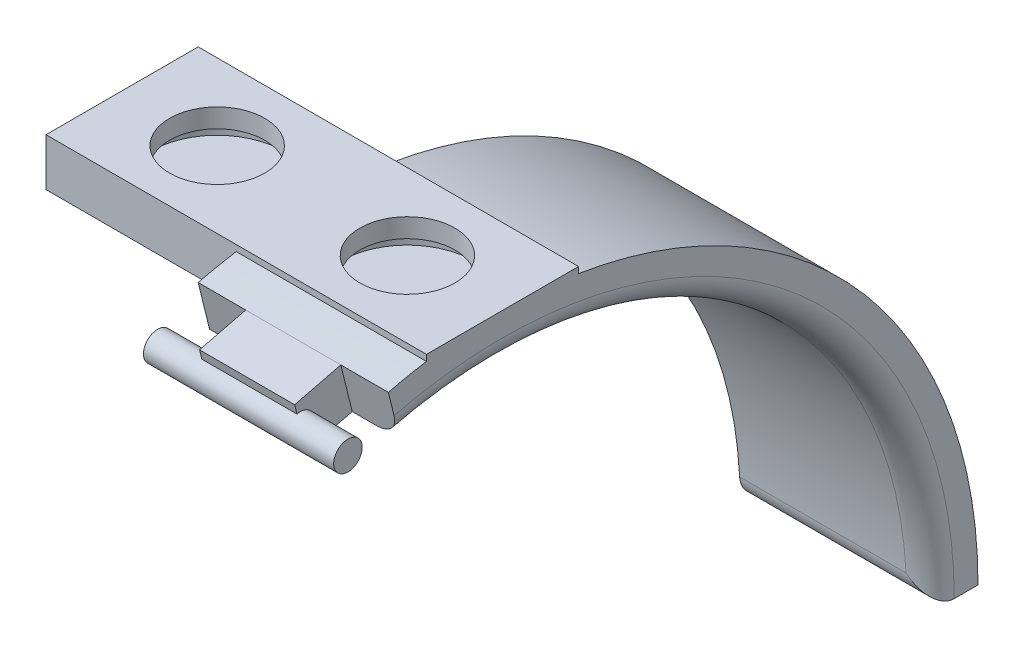
ISO-10303-21;
HEADER;
FILE_DESCRIPTION(('STEP AP214'),'2;1');
FILE_NAME('part.step','',(''),(''),'','','');
FILE_SCHEMA(('AUTOMOTIVE_DESIGN { 1 0 10303 214 1 1 1 1 }'));
ENDSEC;
DATA;
#1=APPLICATION_CONTEXT('core data for automotive mechanical design processes');
#2=APPLICATION_PROTOCOL_DEFINITION('international standard','automotive_design',2000,#1);
#3=PRODUCT_CONTEXT('',#1,'mechanical');
#4=PRODUCT('Part','Part','',(#3));
#5=PRODUCT_RELATED_PRODUCT_CATEGORY('part','',(#4));
#6=PRODUCT_DEFINITION_FORMATION('','',#4);
#7=PRODUCT_DEFINITION_CONTEXT('part definition',#1,'design');
#8=PRODUCT_DEFINITION('design','',#6,#7);
#9=PRODUCT_DEFINITION_SHAPE('','',#8);
#10=(LENGTH_UNIT() NAMED_UNIT(*) SI_UNIT(.MILLI.,.METRE.));
#11=(NAMED_UNIT(*) PLANE_ANGLE_UNIT() SI_UNIT($,.RADIAN.));
#12=(NAMED_UNIT(*) SI_UNIT($,.STERADIAN.) SOLID_ANGLE_UNIT());
#13=UNCERTAINTY_MEASURE_WITH_UNIT(LENGTH_MEASURE(1.E-05),#10,'distance_accuracy_value','');
#14=(GEOMETRIC_REPRESENTATION_CONTEXT(3) GLOBAL_UNCERTAINTY_ASSIGNED_CONTEXT((#13)) GLOBAL_UNIT_ASSIGNED_CONTEXT((#10,
#11,#12)) REPRESENTATION_CONTEXT('',''));
#15=CARTESIAN_POINT('',(0.,0.,0.));
#16=DIRECTION('',(0.,0.,1.));
#17=DIRECTION('',(1.,0.,0.));
#18=AXIS2_PLACEMENT_3D('',#15,#16,#17);
#19=CARTESIAN_POINT('',(0.,-1.2,4.85386443980464));
#20=DIRECTION('',(0.,-0.24,0.970772887960928));
#21=DIRECTION('',(0.,-0.970772887960928,-0.24));
#22=AXIS2_PLACEMENT_3D('',#19,#20,#21);
#23=PLANE('',#22);
#24=DIRECTION('',(1.,0.,0.));
#25=VECTOR('',#24,1.);
#26=CARTESIAN_POINT('',(0.,46.3678715100855,16.6138644398046));
#27=LINE('',#26,#25);
#28=CARTESIAN_POINT('',(15.,46.3678715100855,16.6138644398046));
#29=VERTEX_POINT('',#28);
#30=CARTESIAN_POINT('',(5.,46.3678715100855,16.6138644398046));
#31=VERTEX_POINT('',#30);
#32=EDGE_CURVE('E168',#29,#31,#27,.F.);
#33=ORIENTED_EDGE('',*,*,#32,.F.);
#34=DIRECTION('',(0.,-0.970772887960928,-0.24));
#35=VECTOR('',#34,1.);
#36=CARTESIAN_POINT('',(15.,42.4847799582418,15.6538644398046));
#37=LINE('',#36,#35);
#38=CARTESIAN_POINT('',(15.,47.3386443980464,16.8538644398046));
#39=VERTEX_POINT('',#38);
#40=EDGE_CURVE('E171',#39,#29,#37,.T.);
#41=ORIENTED_EDGE('',*,*,#40,.F.);
#42=DIRECTION('',(-1.,0.,0.));
#43=VECTOR('',#42,1.);
#44=CARTESIAN_POINT('',(10.,47.3386443980464,16.8538644398046));
#45=LINE('',#44,#43);
#46=CARTESIAN_POINT('',(5.,47.3386443980464,16.8538644398046));
#47=VERTEX_POINT('',#46);
#48=EDGE_CURVE('E210',#39,#47,#45,.T.);
#49=ORIENTED_EDGE('',*,*,#48,.T.);
#50=DIRECTION('',(0.,-0.970772887960928,-0.24));
#51=VECTOR('',#50,1.);
#52=CARTESIAN_POINT('',(5.,42.4847799582418,15.6538644398046));
#53=LINE('',#52,#51);
#54=EDGE_CURVE('E173',#47,#31,#53,.T.);
#55=ORIENTED_EDGE('',*,*,#54,.T.);
#56=EDGE_LOOP('',(#33,#41,#49,#55));
#57=FACE_BOUND('',#56,.T.);
#58=ADVANCED_FACE('F35',(#57),#23,.T.);
#59=CARTESIAN_POINT('',(15.,43.4555528462027,15.8938644398046));
#60=VERTEX_POINT('',#59);
#61=CARTESIAN_POINT('',(15.,42.4847799582418,15.6538644398046));
#62=VERTEX_POINT('',#61);
#63=EDGE_CURVE('E192',#60,#62,#37,.T.);
#64=ORIENTED_EDGE('',*,*,#63,.F.);
#65=DIRECTION('',(1.,0.,0.));
#66=VECTOR('',#65,1.);
#67=CARTESIAN_POINT('',(0.,43.4555528462027,15.8938644398046));
#68=LINE('',#67,#66);
#69=CARTESIAN_POINT('',(5.,43.4555528462027,15.8938644398046));
#70=VERTEX_POINT('',#69);
#71=EDGE_CURVE('E176',#70,#60,#68,.T.);
#72=ORIENTED_EDGE('',*,*,#71,.F.);
#73=CARTESIAN_POINT('',(5.,42.4847799582418,15.6538644398046));
#74=VERTEX_POINT('',#73);
#75=EDGE_CURVE('E212',#70,#74,#53,.T.);
#76=ORIENTED_EDGE('',*,*,#75,.T.);
#77=DIRECTION('',(1.,0.,0.));
#78=VECTOR('',#77,1.);
#79=CARTESIAN_POINT('',(10.,42.4847799582418,15.6538644398046));
#80=LINE('',#79,#78);
#81=EDGE_CURVE('E215',#74,#62,#80,.T.);
#82=ORIENTED_EDGE('',*,*,#81,.T.);
#83=EDGE_LOOP('',(#64,#72,#76,#82));
#84=FACE_BOUND('',#83,.T.);
#85=ADVANCED_FACE('F397',(#84),#23,.T.);
#86=CARTESIAN_POINT('',(15.,42.4847799582418,15.6538644398046));
#87=DIRECTION('',(1.,0.,0.));
#88=DIRECTION('',(0.,0.,-1.));
#89=AXIS2_PLACEMENT_3D('',#86,#87,#88);
#90=PLANE('',#89);
#91=ORIENTED_EDGE('',*,*,#40,.T.);
#92=CARTESIAN_POINT('',(15.,44.9117121781441,16.2538644398046));
#93=DIRECTION('',(1.,0.,0.));
#94=DIRECTION('',(0.,0.,-1.));
#95=AXIS2_PLACEMENT_3D('',#92,#93,#94);
#96=CIRCLE('',#95,1.5);
#97=EDGE_CURVE('E180',#29,#60,#96,.F.);
#98=ORIENTED_EDGE('',*,*,#97,.T.);
#99=ORIENTED_EDGE('',*,*,#63,.T.);
#100=DIRECTION('',(0.,0.24,-0.970772887960928));
#101=VECTOR('',#100,1.);
#102=CARTESIAN_POINT('',(15.,42.4847799582418,15.6538644398046));
#103=LINE('',#102,#101);
#104=CARTESIAN_POINT('',(15.,43.6847799582418,10.8));
#105=VERTEX_POINT('',#104);
#106=EDGE_CURVE('E194',#62,#105,#103,.T.);
#107=ORIENTED_EDGE('',*,*,#106,.T.);
#108=DIRECTION('',(0.,-0.970772887960928,-0.24));
#109=VECTOR('',#108,1.);
#110=CARTESIAN_POINT('',(15.,43.6847799582418,10.8));
#111=LINE('',#110,#109);
#112=CARTESIAN_POINT('',(15.,48.5386443980464,12.));
#113=VERTEX_POINT('',#112);
#114=EDGE_CURVE('E196',#113,#105,#111,.T.);
#115=ORIENTED_EDGE('',*,*,#114,.F.);
#116=DIRECTION('',(0.,0.24,-0.970772887960928));
#117=VECTOR('',#116,1.);
#118=CARTESIAN_POINT('',(15.,47.3386443980464,16.8538644398046));
#119=LINE('',#118,#117);
#120=EDGE_CURVE('E191',#39,#113,#119,.T.);
#121=ORIENTED_EDGE('',*,*,#120,.F.);
#122=EDGE_LOOP('',(#91,#98,#99,#107,#115,#121));
#123=FACE_BOUND('',#122,.T.);
#124=ADVANCED_FACE('F188',(#123),#90,.T.);
#125=CARTESIAN_POINT('',(0.,0.,0.));
#126=DIRECTION('',(0.,-0.24,0.970772887960928));
#127=DIRECTION('',(0.,-0.970772887960928,-0.24));
#128=AXIS2_PLACEMENT_3D('',#125,#126,#127);
#129=PLANE('',#128);
#130=DIRECTION('',(1.,0.,0.));
#131=VECTOR('',#130,1.);
#132=CARTESIAN_POINT('',(0.,43.6847799582418,10.8));
#133=LINE('',#132,#131);
#134=CARTESIAN_POINT('',(17.5,43.6847799582418,10.8));
#135=VERTEX_POINT('',#134);
#136=EDGE_CURVE('E230',#105,#135,#133,.T.);
#137=ORIENTED_EDGE('',*,*,#136,.T.);
#138=CARTESIAN_POINT('',(17.5,46.1117121781441,11.4));
#139=DIRECTION('',(0.,-0.24,0.970772887960928));
#140=DIRECTION('',(0.,-0.970772887960928,-0.24));
#141=AXIS2_PLACEMENT_3D('',#138,#139,#140);
#142=CIRCLE('',#141,2.5);
#143=CARTESIAN_POINT('',(20.,46.1117121781441,11.4));
#144=VERTEX_POINT('',#143);
#145=EDGE_CURVE('E48',#135,#144,#142,.T.);
#146=ORIENTED_EDGE('',*,*,#145,.T.);
#147=DIRECTION('',(0.,0.970772887960928,0.24));
#148=VECTOR('',#147,1.);
#149=CARTESIAN_POINT('',(20.,48.5386443980464,12.));
#150=LINE('',#149,#148);
#151=CARTESIAN_POINT('',(20.,48.5386443980464,12.));
#152=VERTEX_POINT('',#151);
#153=EDGE_CURVE('E234',#144,#152,#150,.T.);
#154=ORIENTED_EDGE('',*,*,#153,.T.);
#155=DIRECTION('',(-1.,0.,0.));
#156=VECTOR('',#155,1.);
#157=CARTESIAN_POINT('',(0.,48.5386443980464,12.));
#158=LINE('',#157,#156);
#159=EDGE_CURVE('E238',#152,#113,#158,.T.);
#160=ORIENTED_EDGE('',*,*,#159,.T.);
#161=ORIENTED_EDGE('',*,*,#114,.T.);
#162=EDGE_LOOP('',(#137,#146,#154,#160,#161));
#163=FACE_BOUND('',#162,.T.);
#164=ADVANCED_FACE('F327',(#163),#129,.T.);
#165=CARTESIAN_POINT('',(0.,43.6847799582418,10.8));
#166=VERTEX_POINT('',#165);
#167=CARTESIAN_POINT('',(5.,43.6847799582418,10.8));
#168=VERTEX_POINT('',#167);
#169=EDGE_CURVE('E231',#166,#168,#133,.T.);
#170=ORIENTED_EDGE('',*,*,#169,.T.);
#171=DIRECTION('',(0.,-0.970772887960928,-0.24));
#172=VECTOR('',#171,1.);
#173=CARTESIAN_POINT('',(5.,43.6847799582418,10.8));
#174=LINE('',#173,#172);
#175=CARTESIAN_POINT('',(5.,48.5386443980464,12.));
#176=VERTEX_POINT('',#175);
#177=EDGE_CURVE('E213',#176,#168,#174,.T.);
#178=ORIENTED_EDGE('',*,*,#177,.F.);
#179=CARTESIAN_POINT('',(0.,48.5386443980464,12.));
#180=VERTEX_POINT('',#179);
#181=EDGE_CURVE('E237',#176,#180,#158,.T.);
#182=ORIENTED_EDGE('',*,*,#181,.T.);
#183=DIRECTION('',(0.,-0.970772887960928,-0.24));
#184=VECTOR('',#183,1.);
#185=CARTESIAN_POINT('',(0.,48.5386443980464,12.));
#186=LINE('',#185,#184);
#187=EDGE_CURVE('E228',#180,#166,#186,.T.);
#188=ORIENTED_EDGE('',*,*,#187,.T.);
#189=EDGE_LOOP('',(#170,#178,#182,#188));
#190=FACE_BOUND('',#189,.T.);
#191=ADVANCED_FACE('F381',(#190),#129,.T.);
#192=CARTESIAN_POINT('',(20.,0.,0.));
#193=DIRECTION('',(-1.,0.,0.));
#194=DIRECTION('',(0.,0.,1.));
#195=AXIS2_PLACEMENT_3D('',#192,#193,#194);
#196=CYLINDRICAL_SURFACE('',#195,50.);
#197=ORIENTED_EDGE('',*,*,#159,.F.);
#198=CARTESIAN_POINT('',(20.,0.,0.));
#199=DIRECTION('',(1.,0.,0.));
#200=DIRECTION('',(0.,0.,-1.));
#201=AXIS2_PLACEMENT_3D('',#198,#199,#200);
#202=CIRCLE('',#201,50.);
#203=CARTESIAN_POINT('',(20.,49.3558507170123,8.));
#204=VERTEX_POINT('',#203);
#205=EDGE_CURVE('E291',#204,#152,#202,.T.);
#206=ORIENTED_EDGE('',*,*,#205,.F.);
#207=DIRECTION('',(-1.,0.,0.));
#208=VECTOR('',#207,1.);
#209=CARTESIAN_POINT('',(20.,49.3558507170123,8.));
#210=LINE('',#209,#208);
#211=CARTESIAN_POINT('',(0.,49.3558507170123,8.));
#212=VERTEX_POINT('',#211);
#213=EDGE_CURVE('E285',#204,#212,#210,.T.);
#214=ORIENTED_EDGE('',*,*,#213,.T.);
#215=CARTESIAN_POINT('',(0.,0.,0.));
#216=DIRECTION('',(1.,0.,0.));
#217=DIRECTION('',(0.,0.,-1.));
#218=AXIS2_PLACEMENT_3D('',#215,#216,#217);
#219=CIRCLE('',#218,50.);
#220=EDGE_CURVE('E301',#212,#180,#219,.T.);
#221=ORIENTED_EDGE('',*,*,#220,.T.);
#222=ORIENTED_EDGE('',*,*,#181,.F.);
#223=DIRECTION('',(-1.,0.,0.));
#224=VECTOR('',#223,1.);
#225=CARTESIAN_POINT('',(10.,48.5386443980464,12.));
#226=LINE('',#225,#224);
#227=EDGE_CURVE('E209',#113,#176,#226,.T.);
#228=ORIENTED_EDGE('',*,*,#227,.F.);
#229=EDGE_LOOP('',(#197,#206,#214,#221,#222,#228));
#230=FACE_BOUND('',#229,.T.);
#231=ADVANCED_FACE('F368',(#230),#196,.T.);
#232=CARTESIAN_POINT('',(0.,0.,0.));
#233=DIRECTION('',(1.,0.,0.));
#234=DIRECTION('',(0.,0.,-1.));
#235=AXIS2_PLACEMENT_3D('',#232,#233,#234);
#236=PLANE('',#235);
#237=ORIENTED_EDGE('',*,*,#187,.F.);
#238=ORIENTED_EDGE('',*,*,#220,.F.);
#239=DIRECTION('',(0.,-1.,0.));
#240=VECTOR('',#239,1.);
#241=CARTESIAN_POINT('',(0.,0.,8.));
#242=LINE('',#241,#240);
#243=CARTESIAN_POINT('',(0.,45.,8.));
#244=VERTEX_POINT('',#243);
#245=EDGE_CURVE('E177',#212,#244,#242,.T.);
#246=ORIENTED_EDGE('',*,*,#245,.T.);
#247=DIRECTION('',(0.,0.,-1.));
#248=VECTOR('',#247,1.);
#249=CARTESIAN_POINT('',(0.,45.,0.));
#250=LINE('',#249,#248);
#251=CARTESIAN_POINT('',(0.,45.,0.));
#252=VERTEX_POINT('',#251);
#253=EDGE_CURVE('E309',#244,#252,#250,.T.);
#254=ORIENTED_EDGE('',*,*,#253,.T.);
#255=CARTESIAN_POINT('',(0.,0.,0.));
#256=DIRECTION('',(-1.,0.,0.));
#257=DIRECTION('',(0.,0.,-1.));
#258=AXIS2_PLACEMENT_3D('',#255,#256,#257);
#259=CIRCLE('',#258,45.);
#260=EDGE_CURVE('E297',#166,#252,#259,.T.);
#261=ORIENTED_EDGE('',*,*,#260,.F.);
#262=EDGE_LOOP('',(#237,#238,#246,#254,#261));
#263=FACE_BOUND('',#262,.T.);
#264=ADVANCED_FACE('F361',(#263),#236,.F.);
#265=CARTESIAN_POINT('',(20.,0.,0.));
#266=DIRECTION('',(-1.,0.,0.));
#267=DIRECTION('',(0.,0.,1.));
#268=AXIS2_PLACEMENT_3D('',#265,#266,#267);
#269=CYLINDRICAL_SURFACE('',#268,45.);
#270=DIRECTION('',(-1.,0.,0.));
#271=VECTOR('',#270,1.);
#272=CARTESIAN_POINT('',(20.,2.36842105263158,-44.9376299076559));
#273=LINE('',#272,#271);
#274=CARTESIAN_POINT('',(0.,2.36842105263158,-44.9376299076559));
#275=VERTEX_POINT('',#274);
#276=CARTESIAN_POINT('',(17.5,2.36842105263158,-44.9376299076559));
#277=VERTEX_POINT('',#276);
#278=EDGE_CURVE('E55',#275,#277,#273,.F.);
#279=ORIENTED_EDGE('',*,*,#278,.T.);
#280=CARTESIAN_POINT('',(17.5,0.,0.));
#281=DIRECTION('',(1.,0.,0.));
#282=DIRECTION('',(0.,0.,-1.));
#283=AXIS2_PLACEMENT_3D('',#280,#281,#282);
#284=CIRCLE('',#283,45.);
#285=EDGE_CURVE('E59',#277,#135,#284,.T.);
#286=ORIENTED_EDGE('',*,*,#285,.T.);
#287=ORIENTED_EDGE('',*,*,#136,.F.);
#288=EDGE_CURVE('E235',#168,#105,#133,.T.);
#289=ORIENTED_EDGE('',*,*,#288,.F.);
#290=ORIENTED_EDGE('',*,*,#169,.F.);
#291=ORIENTED_EDGE('',*,*,#260,.T.);
#292=EDGE_CURVE('E288',#252,#275,#259,.T.);
#293=ORIENTED_EDGE('',*,*,#292,.T.);
#294=EDGE_LOOP('',(#279,#286,#287,#289,#290,#291,#293));
#295=FACE_BOUND('',#294,.T.);
#296=ADVANCED_FACE('F350',(#295),#269,.F.);
#297=CARTESIAN_POINT('',(20.,0.,0.));
#298=DIRECTION('',(1.,0.,0.));
#299=DIRECTION('',(0.,0.,-1.));
#300=AXIS2_PLACEMENT_3D('',#297,#298,#299);
#301=PLANE('',#300);
#302=ORIENTED_EDGE('',*,*,#153,.F.);
#303=CARTESIAN_POINT('',(20.,0.,0.));
#304=DIRECTION('',(1.,0.,0.));
#305=DIRECTION('',(0.,0.,-1.));
#306=AXIS2_PLACEMENT_3D('',#303,#304,#305);
#307=CIRCLE('',#306,47.5);
#308=CARTESIAN_POINT('',(20.,0.,-47.5));
#309=VERTEX_POINT('',#308);
#310=EDGE_CURVE('E185',#144,#309,#307,.F.);
#311=ORIENTED_EDGE('',*,*,#310,.T.);
#312=DIRECTION('',(0.,0.,-1.));
#313=VECTOR('',#312,1.);
#314=CARTESIAN_POINT('',(20.,0.,-45.));
#315=LINE('',#314,#313);
#316=CARTESIAN_POINT('',(20.,0.,-50.));
#317=VERTEX_POINT('',#316);
#318=EDGE_CURVE('E289',#309,#317,#315,.T.);
#319=ORIENTED_EDGE('',*,*,#318,.T.);
#320=CARTESIAN_POINT('',(20.,49.3558507170123,-8.));
#321=VERTEX_POINT('',#320);
#322=EDGE_CURVE('E293',#317,#321,#202,.T.);
#323=ORIENTED_EDGE('',*,*,#322,.T.);
#324=DIRECTION('',(0.,1.,0.));
#325=VECTOR('',#324,1.);
#326=CARTESIAN_POINT('',(20.,45.,-8.));
#327=LINE('',#326,#325);
#328=CARTESIAN_POINT('',(20.,50.,-8.));
#329=VERTEX_POINT('',#328);
#330=EDGE_CURVE('E253',#321,#329,#327,.T.);
#331=ORIENTED_EDGE('',*,*,#330,.T.);
#332=DIRECTION('',(0.,0.,1.));
#333=VECTOR('',#332,1.);
#334=CARTESIAN_POINT('',(20.,50.,-8.));
#335=LINE('',#334,#333);
#336=CARTESIAN_POINT('',(20.,50.,8.));
#337=VERTEX_POINT('',#336);
#338=EDGE_CURVE('E255',#329,#337,#335,.T.);
#339=ORIENTED_EDGE('',*,*,#338,.T.);
#340=DIRECTION('',(0.,-1.,0.));
#341=VECTOR('',#340,1.);
#342=CARTESIAN_POINT('',(20.,50.,8.));
#343=LINE('',#342,#341);
#344=EDGE_CURVE('E257',#337,#204,#343,.T.);
#345=ORIENTED_EDGE('',*,*,#344,.T.);
#346=ORIENTED_EDGE('',*,*,#205,.T.);
#347=EDGE_LOOP('',(#302,#311,#319,#323,#331,#339,#345,#346));
#348=FACE_BOUND('',#347,.T.);
#349=ADVANCED_FACE('F333',(#348),#301,.T.);
#350=CARTESIAN_POINT('',(20.,0.,-45.));
#351=DIRECTION('',(0.,1.,0.));
#352=DIRECTION('',(0.,0.,1.));
#353=AXIS2_PLACEMENT_3D('',#350,#351,#352);
#354=PLANE('',#353);
#355=ORIENTED_EDGE('',*,*,#318,.F.);
#356=CARTESIAN_POINT('',(17.5,0.,-47.5));
#357=DIRECTION('',(0.,1.,0.));
#358=DIRECTION('',(0.,0.,1.));
#359=AXIS2_PLACEMENT_3D('',#356,#357,#358);
#360=CIRCLE('',#359,2.5);
#361=CARTESIAN_POINT('',(19.9991329976495,0.,-47.4341649025257));
#362=VERTEX_POINT('',#361);
#363=EDGE_CURVE('E320',#309,#362,#360,.F.);
#364=ORIENTED_EDGE('',*,*,#363,.T.);
#365=DIRECTION('',(-1.,0.,0.));
#366=VECTOR('',#365,1.);
#367=CARTESIAN_POINT('',(20.,0.,-47.4341649025257));
#368=LINE('',#367,#366);
#369=CARTESIAN_POINT('',(0.,0.,-47.4341649025257));
#370=VERTEX_POINT('',#369);
#371=EDGE_CURVE('E318',#362,#370,#368,.T.);
#372=ORIENTED_EDGE('',*,*,#371,.T.);
#373=DIRECTION('',(0.,0.,-1.));
#374=VECTOR('',#373,1.);
#375=CARTESIAN_POINT('',(0.,0.,-45.));
#376=LINE('',#375,#374);
#377=CARTESIAN_POINT('',(0.,0.,-50.));
#378=VERTEX_POINT('',#377);
#379=EDGE_CURVE('E299',#370,#378,#376,.T.);
#380=ORIENTED_EDGE('',*,*,#379,.T.);
#381=DIRECTION('',(-1.,0.,0.));
#382=VECTOR('',#381,1.);
#383=CARTESIAN_POINT('',(20.,0.,-50.));
#384=LINE('',#383,#382);
#385=EDGE_CURVE('E296',#317,#378,#384,.T.);
#386=ORIENTED_EDGE('',*,*,#385,.F.);
#387=EDGE_LOOP('',(#355,#364,#372,#380,#386));
#388=FACE_BOUND('',#387,.T.);
#389=ADVANCED_FACE('F340',(#388),#354,.F.);
#390=CARTESIAN_POINT('',(0.,49.3558507170123,-8.));
#391=VERTEX_POINT('',#390);
#392=EDGE_CURVE('E292',#378,#391,#219,.T.);
#393=ORIENTED_EDGE('',*,*,#392,.T.);
#394=DIRECTION('',(-1.,0.,0.));
#395=VECTOR('',#394,1.);
#396=CARTESIAN_POINT('',(20.,49.3558507170123,-8.));
#397=LINE('',#396,#395);
#398=EDGE_CURVE('E275',#391,#321,#397,.F.);
#399=ORIENTED_EDGE('',*,*,#398,.T.);
#400=ORIENTED_EDGE('',*,*,#322,.F.);
#401=ORIENTED_EDGE('',*,*,#385,.T.);
#402=EDGE_LOOP('',(#393,#399,#400,#401));
#403=FACE_BOUND('',#402,.T.);
#404=ADVANCED_FACE('F478',(#403),#196,.T.);
#405=ORIENTED_EDGE('',*,*,#379,.F.);
#406=CARTESIAN_POINT('',(0.,2.5,-47.4341649025257));
#407=DIRECTION('',(1.,0.,0.));
#408=DIRECTION('',(0.,0.,-1.));
#409=AXIS2_PLACEMENT_3D('',#406,#407,#408);
#410=CIRCLE('',#409,2.5);
#411=EDGE_CURVE('E11',#370,#275,#410,.F.);
#412=ORIENTED_EDGE('',*,*,#411,.T.);
#413=ORIENTED_EDGE('',*,*,#292,.F.);
#414=CARTESIAN_POINT('',(0.,45.,-8.));
#415=VERTEX_POINT('',#414);
#416=EDGE_CURVE('E306',#252,#415,#250,.T.);
#417=ORIENTED_EDGE('',*,*,#416,.T.);
#418=DIRECTION('',(0.,1.,0.));
#419=VECTOR('',#418,1.);
#420=CARTESIAN_POINT('',(0.,0.,-8.));
#421=LINE('',#420,#419);
#422=EDGE_CURVE('E310',#415,#391,#421,.T.);
#423=ORIENTED_EDGE('',*,*,#422,.T.);
#424=ORIENTED_EDGE('',*,*,#392,.F.);
#425=EDGE_LOOP('',(#405,#412,#413,#417,#423,#424));
#426=FACE_BOUND('',#425,.T.);
#427=ADVANCED_FACE('F348',(#426),#236,.F.);
#428=CARTESIAN_POINT('',(-20.,50.,8.));
#429=DIRECTION('',(0.,0.,1.));
#430=DIRECTION('',(1.,0.,0.));
#431=AXIS2_PLACEMENT_3D('',#428,#429,#430);
#432=PLANE('',#431);
#433=ORIENTED_EDGE('',*,*,#213,.F.);
#434=ORIENTED_EDGE('',*,*,#344,.F.);
#435=DIRECTION('',(1.,0.,0.));
#436=VECTOR('',#435,1.);
#437=CARTESIAN_POINT('',(-20.,50.,8.));
#438=LINE('',#437,#436);
#439=CARTESIAN_POINT('',(-20.,50.,8.));
#440=VERTEX_POINT('',#439);
#441=EDGE_CURVE('E276',#440,#337,#438,.T.);
#442=ORIENTED_EDGE('',*,*,#441,.F.);
#443=DIRECTION('',(0.,-1.,0.));
#444=VECTOR('',#443,1.);
#445=CARTESIAN_POINT('',(-20.,50.,8.));
#446=LINE('',#445,#444);
#447=CARTESIAN_POINT('',(-20.,45.,8.));
#448=VERTEX_POINT('',#447);
#449=EDGE_CURVE('E268',#440,#448,#446,.T.);
#450=ORIENTED_EDGE('',*,*,#449,.T.);
#451=DIRECTION('',(1.,0.,0.));
#452=VECTOR('',#451,1.);
#453=CARTESIAN_POINT('',(-20.,45.,8.));
#454=LINE('',#453,#452);
#455=EDGE_CURVE('E272',#448,#244,#454,.T.);
#456=ORIENTED_EDGE('',*,*,#455,.T.);
#457=ORIENTED_EDGE('',*,*,#245,.F.);
#458=EDGE_LOOP('',(#433,#434,#442,#450,#456,#457));
#459=FACE_BOUND('',#458,.T.);
#460=ADVANCED_FACE('F365',(#459),#432,.T.);
#461=CARTESIAN_POINT('',(-20.,45.,-8.));
#462=DIRECTION('',(0.,0.,-1.));
#463=DIRECTION('',(-1.,0.,0.));
#464=AXIS2_PLACEMENT_3D('',#461,#462,#463);
#465=PLANE('',#464);
#466=ORIENTED_EDGE('',*,*,#398,.F.);
#467=ORIENTED_EDGE('',*,*,#422,.F.);
#468=DIRECTION('',(1.,0.,0.));
#469=VECTOR('',#468,1.);
#470=CARTESIAN_POINT('',(-20.,45.,-8.));
#471=LINE('',#470,#469);
#472=CARTESIAN_POINT('',(-20.,45.,-8.));
#473=VERTEX_POINT('',#472);
#474=EDGE_CURVE('E271',#473,#415,#471,.T.);
#475=ORIENTED_EDGE('',*,*,#474,.F.);
#476=DIRECTION('',(0.,1.,0.));
#477=VECTOR('',#476,1.);
#478=CARTESIAN_POINT('',(-20.,45.,-8.));
#479=LINE('',#478,#477);
#480=CARTESIAN_POINT('',(-20.,50.,-8.));
#481=VERTEX_POINT('',#480);
#482=EDGE_CURVE('E262',#473,#481,#479,.T.);
#483=ORIENTED_EDGE('',*,*,#482,.T.);
#484=DIRECTION('',(1.,0.,0.));
#485=VECTOR('',#484,1.);
#486=CARTESIAN_POINT('',(-20.,50.,-8.));
#487=LINE('',#486,#485);
#488=EDGE_CURVE('E279',#481,#329,#487,.T.);
#489=ORIENTED_EDGE('',*,*,#488,.T.);
#490=ORIENTED_EDGE('',*,*,#330,.F.);
#491=EDGE_LOOP('',(#466,#467,#475,#483,#489,#490));
#492=FACE_BOUND('',#491,.T.);
#493=ADVANCED_FACE('F473',(#492),#465,.T.);
#494=CARTESIAN_POINT('',(-20.,45.,0.));
#495=DIRECTION('',(0.,-1.,0.));
#496=DIRECTION('',(0.,0.,-1.));
#497=AXIS2_PLACEMENT_3D('',#494,#495,#496);
#498=PLANE('',#497);
#499=ORIENTED_EDGE('',*,*,#253,.F.);
#500=ORIENTED_EDGE('',*,*,#455,.F.);
#501=DIRECTION('',(0.,0.,-1.));
#502=VECTOR('',#501,1.);
#503=CARTESIAN_POINT('',(-20.,45.,8.));
#504=LINE('',#503,#502);
#505=EDGE_CURVE('E260',#448,#473,#504,.T.);
#506=ORIENTED_EDGE('',*,*,#505,.T.);
#507=ORIENTED_EDGE('',*,*,#474,.T.);
#508=ORIENTED_EDGE('',*,*,#416,.F.);
#509=EDGE_LOOP('',(#499,#500,#506,#507,#508));
#510=FACE_BOUND('',#509,.T.);
#511=ADVANCED_FACE('F358',(#510),#498,.T.);
#512=CARTESIAN_POINT('',(-20.,50.,-8.));
#513=DIRECTION('',(0.,1.,0.));
#514=DIRECTION('',(0.,0.,1.));
#515=AXIS2_PLACEMENT_3D('',#512,#513,#514);
#516=PLANE('',#515);
#517=CARTESIAN_POINT('',(-10.,50.,0.));
#518=DIRECTION('',(0.,1.,0.));
#519=DIRECTION('',(0.,0.,1.));
#520=AXIS2_PLACEMENT_3D('',#517,#518,#519);
#521=CIRCLE('',#520,5.);
#522=CARTESIAN_POINT('',(-10.,50.,5.));
#523=VERTEX_POINT('',#522);
#524=EDGE_CURVE('E451',#523,#523,#521,.T.);
#525=ORIENTED_EDGE('',*,*,#524,.F.);
#526=EDGE_LOOP('',(#525));
#527=FACE_BOUND('',#526,.T.);
#528=CARTESIAN_POINT('',(10.,50.,0.));
#529=DIRECTION('',(0.,1.,0.));
#530=DIRECTION('',(0.,0.,1.));
#531=AXIS2_PLACEMENT_3D('',#528,#529,#530);
#532=CIRCLE('',#531,5.);
#533=CARTESIAN_POINT('',(10.,50.,5.));
#534=VERTEX_POINT('',#533);
#535=EDGE_CURVE('E250',#534,#534,#532,.T.);
#536=ORIENTED_EDGE('',*,*,#535,.F.);
#537=EDGE_LOOP('',(#536));
#538=FACE_BOUND('',#537,.T.);
#539=ORIENTED_EDGE('',*,*,#441,.T.);
#540=ORIENTED_EDGE('',*,*,#338,.F.);
#541=ORIENTED_EDGE('',*,*,#488,.F.);
#542=DIRECTION('',(0.,0.,1.));
#543=VECTOR('',#542,1.);
#544=CARTESIAN_POINT('',(-20.,50.,-8.));
#545=LINE('',#544,#543);
#546=EDGE_CURVE('E265',#481,#440,#545,.T.);
#547=ORIENTED_EDGE('',*,*,#546,.T.);
#548=EDGE_LOOP('',(#539,#540,#541,#547));
#549=FACE_BOUND('',#548,.T.);
#550=ADVANCED_FACE('F461',(#527,#538,#549),#516,.T.);
#551=CARTESIAN_POINT('',(-20.,0.,0.));
#552=DIRECTION('',(1.,0.,0.));
#553=DIRECTION('',(0.,0.,-1.));
#554=AXIS2_PLACEMENT_3D('',#551,#552,#553);
#555=PLANE('',#554);
#556=ORIENTED_EDGE('',*,*,#505,.F.);
#557=ORIENTED_EDGE('',*,*,#449,.F.);
#558=ORIENTED_EDGE('',*,*,#546,.F.);
#559=ORIENTED_EDGE('',*,*,#482,.F.);
#560=EDGE_LOOP('',(#556,#557,#558,#559));
#561=FACE_BOUND('',#560,.T.);
#562=ADVANCED_FACE('F464',(#561),#555,.F.);
#563=CARTESIAN_POINT('',(10.,48.,0.));
#564=DIRECTION('',(0.,1.,0.));
#565=DIRECTION('',(0.,0.,1.));
#566=AXIS2_PLACEMENT_3D('',#563,#564,#565);
#567=CYLINDRICAL_SURFACE('',#566,5.);
#568=CARTESIAN_POINT('',(10.,48.,0.));
#569=DIRECTION('',(0.,1.,0.));
#570=DIRECTION('',(0.,0.,1.));
#571=AXIS2_PLACEMENT_3D('',#568,#569,#570);
#572=CIRCLE('',#571,5.);
#573=CARTESIAN_POINT('',(10.,48.,5.));
#574=VERTEX_POINT('',#573);
#575=EDGE_CURVE('E245',#574,#574,#572,.F.);
#576=ORIENTED_EDGE('',*,*,#575,.T.);
#577=EDGE_LOOP('',(#576));
#578=FACE_BOUND('',#577,.T.);
#579=ORIENTED_EDGE('',*,*,#535,.T.);
#580=EDGE_LOOP('',(#579));
#581=FACE_BOUND('',#580,.T.);
#582=ADVANCED_FACE('F499',(#578,#581),#567,.F.);
#583=CARTESIAN_POINT('',(10.,48.,0.));
#584=DIRECTION('',(0.,1.,0.));
#585=DIRECTION('',(0.,0.,1.));
#586=AXIS2_PLACEMENT_3D('',#583,#584,#585);
#587=PLANE('',#586);
#588=CARTESIAN_POINT('',(10.,48.,0.));
#589=DIRECTION('',(0.,1.,0.));
#590=DIRECTION('',(0.,0.,1.));
#591=AXIS2_PLACEMENT_3D('',#588,#589,#590);
#592=CIRCLE('',#591,7.);
#593=CARTESIAN_POINT('',(10.,48.,7.));
#594=VERTEX_POINT('',#593);
#595=EDGE_CURVE('E241',#594,#594,#592,.T.);
#596=ORIENTED_EDGE('',*,*,#595,.F.);
#597=EDGE_LOOP('',(#596));
#598=FACE_BOUND('',#597,.T.);
#599=ORIENTED_EDGE('',*,*,#575,.F.);
#600=EDGE_LOOP('',(#599));
#601=FACE_BOUND('',#600,.T.);
#602=ADVANCED_FACE('F496',(#598,#601),#587,.F.);
#603=CARTESIAN_POINT('',(10.,46.,0.));
#604=DIRECTION('',(0.,1.,0.));
#605=DIRECTION('',(0.,0.,1.));
#606=AXIS2_PLACEMENT_3D('',#603,#604,#605);
#607=CYLINDRICAL_SURFACE('',#606,7.);
#608=CARTESIAN_POINT('',(10.,46.,0.));
#609=DIRECTION('',(0.,1.,0.));
#610=DIRECTION('',(0.,0.,1.));
#611=AXIS2_PLACEMENT_3D('',#608,#609,#610);
#612=CIRCLE('',#611,7.);
#613=CARTESIAN_POINT('',(10.,46.,7.));
#614=VERTEX_POINT('',#613);
#615=EDGE_CURVE('E242',#614,#614,#612,.T.);
#616=ORIENTED_EDGE('',*,*,#615,.F.);
#617=EDGE_LOOP('',(#616));
#618=FACE_BOUND('',#617,.T.);
#619=ORIENTED_EDGE('',*,*,#595,.T.);
#620=EDGE_LOOP('',(#619));
#621=FACE_BOUND('',#620,.T.);
#622=ADVANCED_FACE('F392',(#618,#621),#607,.F.);
#623=CARTESIAN_POINT('',(10.,46.,0.));
#624=DIRECTION('',(0.,1.,0.));
#625=DIRECTION('',(0.,0.,1.));
#626=AXIS2_PLACEMENT_3D('',#623,#624,#625);
#627=PLANE('',#626);
#628=ORIENTED_EDGE('',*,*,#615,.T.);
#629=EDGE_LOOP('',(#628));
#630=FACE_BOUND('',#629,.T.);
#631=ADVANCED_FACE('F385',(#630),#627,.T.);
#632=CARTESIAN_POINT('',(10.,47.3386443980464,16.8538644398046));
#633=DIRECTION('',(0.,-0.970772887960928,-0.24));
#634=DIRECTION('',(0.,0.24,-0.970772887960928));
#635=AXIS2_PLACEMENT_3D('',#632,#633,#634);
#636=PLANE('',#635);
#637=ORIENTED_EDGE('',*,*,#227,.T.);
#638=DIRECTION('',(0.,0.24,-0.970772887960928));
#639=VECTOR('',#638,1.);
#640=CARTESIAN_POINT('',(5.,47.3386443980464,16.8538644398046));
#641=LINE('',#640,#639);
#642=EDGE_CURVE('E225',#47,#176,#641,.T.);
#643=ORIENTED_EDGE('',*,*,#642,.F.);
#644=ORIENTED_EDGE('',*,*,#48,.F.);
#645=ORIENTED_EDGE('',*,*,#120,.T.);
#646=EDGE_LOOP('',(#637,#643,#644,#645));
#647=FACE_BOUND('',#646,.T.);
#648=ADVANCED_FACE('F383',(#647),#636,.F.);
#649=CARTESIAN_POINT('',(5.,42.4847799582418,15.6538644398046));
#650=DIRECTION('',(1.,0.,0.));
#651=DIRECTION('',(0.,0.,-1.));
#652=AXIS2_PLACEMENT_3D('',#649,#650,#651);
#653=PLANE('',#652);
#654=ORIENTED_EDGE('',*,*,#75,.F.);
#655=CARTESIAN_POINT('',(5.,44.9117121781441,16.2538644398046));
#656=DIRECTION('',(1.,0.,0.));
#657=DIRECTION('',(0.,0.,-1.));
#658=AXIS2_PLACEMENT_3D('',#655,#656,#657);
#659=CIRCLE('',#658,1.5);
#660=EDGE_CURVE('E207',#70,#31,#659,.T.);
#661=ORIENTED_EDGE('',*,*,#660,.T.);
#662=ORIENTED_EDGE('',*,*,#54,.F.);
#663=ORIENTED_EDGE('',*,*,#642,.T.);
#664=ORIENTED_EDGE('',*,*,#177,.T.);
#665=DIRECTION('',(0.,0.24,-0.970772887960928));
#666=VECTOR('',#665,1.);
#667=CARTESIAN_POINT('',(5.,42.4847799582418,15.6538644398046));
#668=LINE('',#667,#666);
#669=EDGE_CURVE('E218',#74,#168,#668,.T.);
#670=ORIENTED_EDGE('',*,*,#669,.F.);
#671=EDGE_LOOP('',(#654,#661,#662,#663,#664,#670));
#672=FACE_BOUND('',#671,.T.);
#673=ADVANCED_FACE('F378',(#672),#653,.F.);
#674=CARTESIAN_POINT('',(10.,42.4847799582418,15.6538644398046));
#675=DIRECTION('',(0.,0.970772887960928,0.24));
#676=DIRECTION('',(0.,-0.24,0.970772887960928));
#677=AXIS2_PLACEMENT_3D('',#674,#675,#676);
#678=PLANE('',#677);
#679=ORIENTED_EDGE('',*,*,#669,.T.);
#680=ORIENTED_EDGE('',*,*,#288,.T.);
#681=ORIENTED_EDGE('',*,*,#106,.F.);
#682=ORIENTED_EDGE('',*,*,#81,.F.);
#683=EDGE_LOOP('',(#679,#680,#681,#682));
#684=FACE_BOUND('',#683,.T.);
#685=ADVANCED_FACE('F373',(#684),#678,.F.);
#686=CARTESIAN_POINT('',(0.,44.9117121781441,16.2538644398046));
#687=DIRECTION('',(1.,0.,0.));
#688=DIRECTION('',(0.,0.,-1.));
#689=AXIS2_PLACEMENT_3D('',#686,#687,#688);
#690=CYLINDRICAL_SURFACE('',#689,1.5);
#691=CARTESIAN_POINT('',(0.,44.9117121781441,16.2538644398046));
#692=DIRECTION('',(1.,0.,0.));
#693=DIRECTION('',(0.,0.,-1.));
#694=AXIS2_PLACEMENT_3D('',#691,#692,#693);
#695=CIRCLE('',#694,1.5);
#696=CARTESIAN_POINT('',(0.,44.9117121781441,14.7538644398046));
#697=VERTEX_POINT('',#696);
#698=EDGE_CURVE('E204',#697,#697,#695,.T.);
#699=ORIENTED_EDGE('',*,*,#698,.T.);
#700=EDGE_LOOP('',(#699));
#701=FACE_BOUND('',#700,.T.);
#702=ORIENTED_EDGE('',*,*,#660,.F.);
#703=ORIENTED_EDGE('',*,*,#71,.T.);
#704=ORIENTED_EDGE('',*,*,#97,.F.);
#705=ORIENTED_EDGE('',*,*,#32,.T.);
#706=EDGE_LOOP('',(#702,#703,#704,#705));
#707=FACE_BOUND('',#706,.T.);
#708=CARTESIAN_POINT('',(20.,44.9117121781441,16.2538644398046));
#709=DIRECTION('',(1.,0.,0.));
#710=DIRECTION('',(0.,0.,-1.));
#711=AXIS2_PLACEMENT_3D('',#708,#709,#710);
#712=CIRCLE('',#711,1.5);
#713=CARTESIAN_POINT('',(20.,44.9117121781441,14.7538644398046));
#714=VERTEX_POINT('',#713);
#715=EDGE_CURVE('E199',#714,#714,#712,.T.);
#716=ORIENTED_EDGE('',*,*,#715,.F.);
#717=EDGE_LOOP('',(#716));
#718=FACE_BOUND('',#717,.T.);
#719=ADVANCED_FACE('F181',(#701,#707,#718),#690,.T.);
#720=CARTESIAN_POINT('',(0.,44.9117121781441,16.2538644398046));
#721=DIRECTION('',(1.,0.,0.));
#722=DIRECTION('',(0.,0.,-1.));
#723=AXIS2_PLACEMENT_3D('',#720,#721,#722);
#724=PLANE('',#723);
#725=ORIENTED_EDGE('',*,*,#698,.F.);
#726=EDGE_LOOP('',(#725));
#727=FACE_BOUND('',#726,.T.);
#728=ADVANCED_FACE('F410',(#727),#724,.F.);
#729=CARTESIAN_POINT('',(20.,44.9117121781441,16.2538644398046));
#730=DIRECTION('',(-1.,0.,0.));
#731=DIRECTION('',(0.,0.,-1.));
#732=AXIS2_PLACEMENT_3D('',#729,#730,#731);
#733=PLANE('',#732);
#734=ORIENTED_EDGE('',*,*,#715,.T.);
#735=EDGE_LOOP('',(#734));
#736=FACE_BOUND('',#735,.T.);
#737=ADVANCED_FACE('F415',(#736),#733,.F.);
#738=CARTESIAN_POINT('',(-10.,48.,0.));
#739=DIRECTION('',(0.,1.,0.));
#740=DIRECTION('',(0.,0.,1.));
#741=AXIS2_PLACEMENT_3D('',#738,#739,#740);
#742=CYLINDRICAL_SURFACE('',#741,5.);
#743=CARTESIAN_POINT('',(-10.,48.,0.));
#744=DIRECTION('',(0.,1.,0.));
#745=DIRECTION('',(0.,0.,1.));
#746=AXIS2_PLACEMENT_3D('',#743,#744,#745);
#747=CIRCLE('',#746,5.);
#748=CARTESIAN_POINT('',(-10.,48.,5.));
#749=VERTEX_POINT('',#748);
#750=EDGE_CURVE('E447',#749,#749,#747,.F.);
#751=ORIENTED_EDGE('',*,*,#750,.T.);
#752=EDGE_LOOP('',(#751));
#753=FACE_BOUND('',#752,.T.);
#754=ORIENTED_EDGE('',*,*,#524,.T.);
#755=EDGE_LOOP('',(#754));
#756=FACE_BOUND('',#755,.T.);
#757=ADVANCED_FACE('F421',(#753,#756),#742,.F.);
#758=CARTESIAN_POINT('',(-10.,48.,0.));
#759=DIRECTION('',(0.,1.,0.));
#760=DIRECTION('',(0.,0.,1.));
#761=AXIS2_PLACEMENT_3D('',#758,#759,#760);
#762=PLANE('',#761);
#763=CARTESIAN_POINT('',(-10.,48.,0.));
#764=DIRECTION('',(0.,1.,0.));
#765=DIRECTION('',(0.,0.,1.));
#766=AXIS2_PLACEMENT_3D('',#763,#764,#765);
#767=CIRCLE('',#766,7.);
#768=CARTESIAN_POINT('',(-10.,48.,7.));
#769=VERTEX_POINT('',#768);
#770=EDGE_CURVE('E448',#769,#769,#767,.T.);
#771=ORIENTED_EDGE('',*,*,#770,.F.);
#772=EDGE_LOOP('',(#771));
#773=FACE_BOUND('',#772,.T.);
#774=ORIENTED_EDGE('',*,*,#750,.F.);
#775=EDGE_LOOP('',(#774));
#776=FACE_BOUND('',#775,.T.);
#777=ADVANCED_FACE('F429',(#773,#776),#762,.F.);
#778=CARTESIAN_POINT('',(-10.,46.,0.));
#779=DIRECTION('',(0.,1.,0.));
#780=DIRECTION('',(0.,0.,1.));
#781=AXIS2_PLACEMENT_3D('',#778,#779,#780);
#782=CYLINDRICAL_SURFACE('',#781,7.);
#783=CARTESIAN_POINT('',(-10.,46.,0.));
#784=DIRECTION('',(0.,1.,0.));
#785=DIRECTION('',(0.,0.,1.));
#786=AXIS2_PLACEMENT_3D('',#783,#784,#785);
#787=CIRCLE('',#786,7.);
#788=CARTESIAN_POINT('',(-10.,46.,7.));
#789=VERTEX_POINT('',#788);
#790=EDGE_CURVE('E446',#789,#789,#787,.T.);
#791=ORIENTED_EDGE('',*,*,#790,.F.);
#792=EDGE_LOOP('',(#791));
#793=FACE_BOUND('',#792,.T.);
#794=ORIENTED_EDGE('',*,*,#770,.T.);
#795=EDGE_LOOP('',(#794));
#796=FACE_BOUND('',#795,.T.);
#797=ADVANCED_FACE('F431',(#793,#796),#782,.F.);
#798=CARTESIAN_POINT('',(-10.,46.,0.));
#799=DIRECTION('',(0.,1.,0.));
#800=DIRECTION('',(0.,0.,1.));
#801=AXIS2_PLACEMENT_3D('',#798,#799,#800);
#802=PLANE('',#801);
#803=ORIENTED_EDGE('',*,*,#790,.T.);
#804=EDGE_LOOP('',(#803));
#805=FACE_BOUND('',#804,.T.);
#806=ADVANCED_FACE('F434',(#805),#802,.T.);
#807=CARTESIAN_POINT('',(20.,2.5,-47.4341649025257));
#808=DIRECTION('',(-1.,0.,0.));
#809=DIRECTION('',(0.,0.,1.));
#810=AXIS2_PLACEMENT_3D('',#807,#808,#809);
#811=CYLINDRICAL_SURFACE('',#810,2.5);
#812=ORIENTED_EDGE('',*,*,#411,.F.);
#813=ORIENTED_EDGE('',*,*,#371,.F.);
#814=CARTESIAN_POINT('',(19.9991329976495,0.,-47.4341649025257));
#815=CARTESIAN_POINT('',(19.9976565764296,-1.42259376935316E-05,-47.3775697681255));
#816=CARTESIAN_POINT('',(19.9942296527321,0.00192128137508503,-47.321038665841));
#817=CARTESIAN_POINT('',(19.9836007324044,0.00956058760245659,-47.2086366078426));
#818=CARTESIAN_POINT('',(19.9764019801179,0.0152611490966164,-47.1527651269209));
#819=CARTESIAN_POINT('',(19.9584321849041,0.0302333134905301,-47.0426047640163));
#820=CARTESIAN_POINT('',(19.9476932943068,0.0394728922608931,-46.9883062562447));
#821=CARTESIAN_POINT('',(19.9228380437508,0.0613103959117186,-46.8811864188849));
#822=CARTESIAN_POINT('',(19.9087211317996,0.0739088696976981,-46.8283653322949));
#823=CARTESIAN_POINT('',(19.8617591168019,0.11629034449421,-46.6729820731606));
#824=CARTESIAN_POINT('',(19.8242253330719,0.150724594186022,-46.5730426631415));
#825=CARTESIAN_POINT('',(19.7387952444575,0.229841949310458,-46.3819563294755));
#826=CARTESIAN_POINT('',(19.6908746447921,0.27454909806752,-46.2908307566349));
#827=CARTESIAN_POINT('',(19.5640286420659,0.393431050426388,-46.0804059313904));
#828=CARTESIAN_POINT('',(19.4807066762751,0.471944491098875,-45.9662025570913));
#829=CARTESIAN_POINT('',(19.3021680958106,0.640715965985538,-45.7575141457399));
#830=CARTESIAN_POINT('',(19.2069265810271,0.730998603152528,-45.6630715262589));
#831=CARTESIAN_POINT('',(18.96755961897,0.958376261066375,-45.4579281190647));
#832=CARTESIAN_POINT('',(18.8193961694392,1.0994931478718,-45.3564253688239));
#833=CARTESIAN_POINT('',(18.5138640782514,1.39128179958815,-45.1871166189954));
#834=CARTESIAN_POINT('',(18.3564892298345,1.5419600129319,-45.1193336392841));
#835=CARTESIAN_POINT('',(18.0833318151943,1.80436788591799,-45.0301417801356));
#836=CARTESIAN_POINT('',(17.9686870522773,1.91475535924087,-45.0009900738856));
#837=CARTESIAN_POINT('',(17.7383934916524,2.1371383285055,-44.958053176625));
#838=CARTESIAN_POINT('',(17.6227468263291,2.24913063798266,-44.9442409207399));
#839=CARTESIAN_POINT('',(17.5047772934751,2.36377779224087,-44.937877880495));
#840=CARTESIAN_POINT('',(17.5023886297339,2.36609935372698,-44.9377522759717));
#841=CARTESIAN_POINT('',(17.5,2.36842105263158,-44.9376299076559));
#842=B_SPLINE_CURVE_WITH_KNOTS('',3,(#814,#815,#816,#817,#818,#819,#820,#821,#822,#823,#824,
#825,#826,#827,#828,#829,#830,#831,#832,#833,#834,#835,#836,#837,#838,#839,#840,#841),
.UNSPECIFIED.,.F.,.F.,(4,2,2,2,2,2,2,2,2,2,2,2,2,4),(0.,0.16975666842841,0.339367559547577,
0.507478598461318,0.675617126682531,1.01050811187126,1.34619102721724,1.82860400012877,
2.31204211028031,2.9935956506956,3.67561383902862,4.16033736317719,4.64420427726438,
4.65420428199778),.UNSPECIFIED.);
#843=EDGE_CURVE('E40',#277,#362,#842,.F.);
#844=ORIENTED_EDGE('',*,*,#843,.F.);
#845=ORIENTED_EDGE('',*,*,#278,.F.);
#846=EDGE_LOOP('',(#812,#813,#844,#845));
#847=FACE_BOUND('',#846,.T.);
#848=ADVANCED_FACE('F345',(#847),#811,.T.);
#849=CARTESIAN_POINT('',(17.5,0.,0.));
#850=DIRECTION('',(1.,0.,0.));
#851=DIRECTION('',(0.,0.,-1.));
#852=AXIS2_PLACEMENT_3D('',#849,#850,#851);
#853=TOROIDAL_SURFACE('',#852,47.5,2.5);
#854=ORIENTED_EDGE('',*,*,#145,.F.);
#855=ORIENTED_EDGE('',*,*,#285,.F.);
#856=ORIENTED_EDGE('',*,*,#843,.T.);
#857=ORIENTED_EDGE('',*,*,#363,.F.);
#858=ORIENTED_EDGE('',*,*,#310,.F.);
#859=EDGE_LOOP('',(#854,#855,#856,#857,#858));
#860=FACE_BOUND('',#859,.T.);
#861=ADVANCED_FACE('F37',(#860),#853,.T.);
#862=CLOSED_SHELL('',(#58,#85,#124,#164,#191,#231,#264,#296,#349,#389,#404,#427,#460,#493,#511,
#550,#562,#582,#602,#622,#631,#648,#673,#685,#719,#728,#737,#757,#777,#797,#806,#848,#861));
#863=MANIFOLD_SOLID_BREP('B2',#862);
#864=ADVANCED_BREP_SHAPE_REPRESENTATION('',(#18,#863),#14);
#865=SHAPE_DEFINITION_REPRESENTATION(#9,#864);
ENDSEC;
END-ISO-10303-21;
